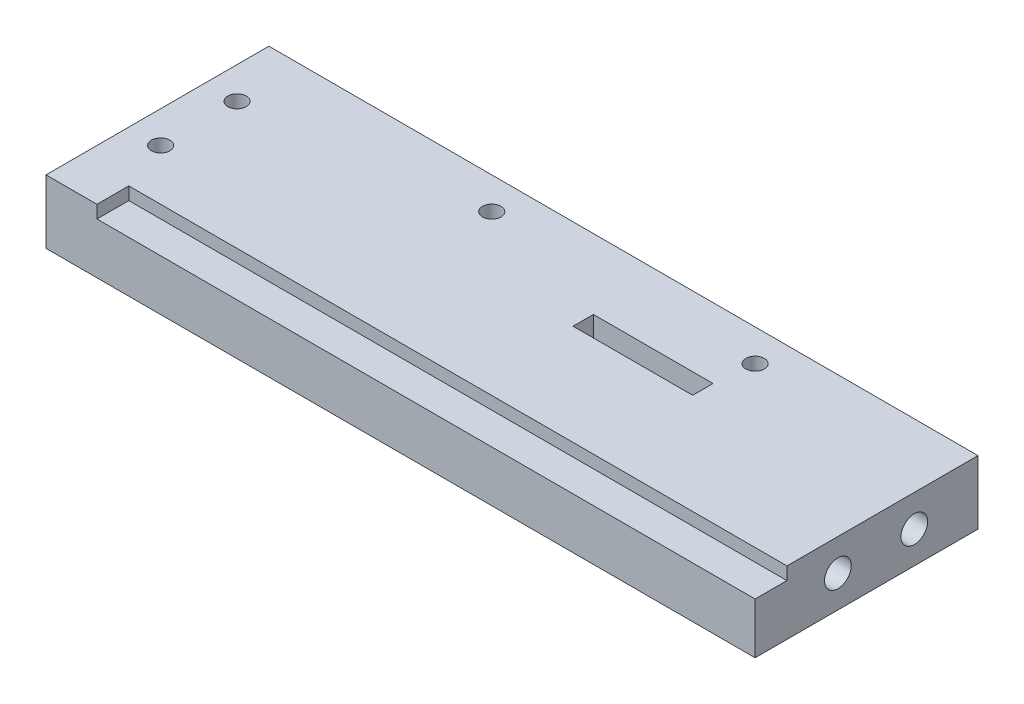
ISO-10303-21;
HEADER;
FILE_DESCRIPTION(('STEP AP214'),'2;1');
FILE_NAME('part.step','',(''),(''),'','','');
FILE_SCHEMA(('AUTOMOTIVE_DESIGN { 1 0 10303 214 1 1 1 1 }'));
ENDSEC;
DATA;
#1=APPLICATION_CONTEXT('core data for automotive mechanical design processes');
#2=APPLICATION_PROTOCOL_DEFINITION('international standard','automotive_design',2000,#1);
#3=PRODUCT_CONTEXT('',#1,'mechanical');
#4=PRODUCT('Part','Part','',(#3));
#5=PRODUCT_RELATED_PRODUCT_CATEGORY('part','',(#4));
#6=PRODUCT_DEFINITION_FORMATION('','',#4);
#7=PRODUCT_DEFINITION_CONTEXT('part definition',#1,'design');
#8=PRODUCT_DEFINITION('design','',#6,#7);
#9=PRODUCT_DEFINITION_SHAPE('','',#8);
#10=(LENGTH_UNIT() NAMED_UNIT(*) SI_UNIT(.MILLI.,.METRE.));
#11=(NAMED_UNIT(*) PLANE_ANGLE_UNIT() SI_UNIT($,.RADIAN.));
#12=(NAMED_UNIT(*) SI_UNIT($,.STERADIAN.) SOLID_ANGLE_UNIT());
#13=UNCERTAINTY_MEASURE_WITH_UNIT(LENGTH_MEASURE(1.E-05),#10,'distance_accuracy_value','');
#14=(GEOMETRIC_REPRESENTATION_CONTEXT(3) GLOBAL_UNCERTAINTY_ASSIGNED_CONTEXT((#13)) GLOBAL_UNIT_ASSIGNED_CONTEXT((#10,
#11,#12)) REPRESENTATION_CONTEXT('',''));
#15=CARTESIAN_POINT('',(0.,0.,0.));
#16=DIRECTION('',(0.,0.,1.));
#17=DIRECTION('',(1.,0.,0.));
#18=AXIS2_PLACEMENT_3D('',#15,#16,#17);
#19=CARTESIAN_POINT('',(24.6707153868862,-63.0696050775741,-125.648132810884));
#20=DIRECTION('',(1.,0.,0.));
#21=DIRECTION('',(0.,0.,-1.));
#22=AXIS2_PLACEMENT_3D('',#19,#20,#21);
#23=PLANE('',#22);
#24=CARTESIAN_POINT('',(24.6707153868862,-58.0696050775741,8.15000000000006));
#25=DIRECTION('',(1.,0.,0.));
#26=DIRECTION('',(0.,0.,-1.));
#27=AXIS2_PLACEMENT_3D('',#24,#25,#26);
#28=CIRCLE('',#27,2.1);
#29=CARTESIAN_POINT('',(24.6707153868862,-58.0696050775741,6.05000000000006));
#30=VERTEX_POINT('',#29);
#31=EDGE_CURVE('E203',#30,#30,#28,.T.);
#32=ORIENTED_EDGE('',*,*,#31,.F.);
#33=EDGE_LOOP('',(#32));
#34=FACE_BOUND('',#33,.T.);
#35=CARTESIAN_POINT('',(24.6707153868862,-58.0696050775741,-3.84999999999994));
#36=DIRECTION('',(1.,0.,0.));
#37=DIRECTION('',(0.,0.,-1.));
#38=AXIS2_PLACEMENT_3D('',#35,#36,#37);
#39=CIRCLE('',#38,2.1);
#40=CARTESIAN_POINT('',(24.6707153868862,-58.0696050775741,-5.94999999999994));
#41=VERTEX_POINT('',#40);
#42=EDGE_CURVE('E213',#41,#41,#39,.T.);
#43=ORIENTED_EDGE('',*,*,#42,.F.);
#44=EDGE_LOOP('',(#43));
#45=FACE_BOUND('',#44,.T.);
#46=DIRECTION('',(0.,1.,0.));
#47=VECTOR('',#46,1.);
#48=CARTESIAN_POINT('',(24.6707153868862,-8.06960507757404,16.1500000000001));
#49=LINE('',#48,#47);
#50=CARTESIAN_POINT('',(24.6707153868862,-55.0696050775741,16.1500000000001));
#51=VERTEX_POINT('',#50);
#52=CARTESIAN_POINT('',(24.6707153868862,-53.0696050775741,16.1500000000001));
#53=VERTEX_POINT('',#52);
#54=EDGE_CURVE('E232',#51,#53,#49,.T.);
#55=ORIENTED_EDGE('',*,*,#54,.F.);
#56=DIRECTION('',(0.,0.,-1.));
#57=VECTOR('',#56,1.);
#58=CARTESIAN_POINT('',(24.6707153868862,-55.0696050775741,21.1500000000001));
#59=LINE('',#58,#57);
#60=CARTESIAN_POINT('',(24.6707153868862,-55.0696050775741,21.1500000000001));
#61=VERTEX_POINT('',#60);
#62=EDGE_CURVE('E131',#61,#51,#59,.T.);
#63=ORIENTED_EDGE('',*,*,#62,.F.);
#64=DIRECTION('',(0.,1.,0.));
#65=VECTOR('',#64,1.);
#66=CARTESIAN_POINT('',(24.6707153868862,-63.0696050775741,21.1500000000001));
#67=LINE('',#66,#65);
#68=CARTESIAN_POINT('',(24.6707153868862,-63.0696050775741,21.1500000000001));
#69=VERTEX_POINT('',#68);
#70=EDGE_CURVE('E125',#69,#61,#67,.T.);
#71=ORIENTED_EDGE('',*,*,#70,.F.);
#72=DIRECTION('',(0.,0.,1.));
#73=VECTOR('',#72,1.);
#74=CARTESIAN_POINT('',(24.6707153868862,-63.0696050775741,-125.648132810884));
#75=LINE('',#74,#73);
#76=CARTESIAN_POINT('',(24.6707153868862,-63.0696050775741,-13.8499999999999));
#77=VERTEX_POINT('',#76);
#78=EDGE_CURVE('E128',#77,#69,#75,.T.);
#79=ORIENTED_EDGE('',*,*,#78,.F.);
#80=DIRECTION('',(0.,-1.,0.));
#81=VECTOR('',#80,1.);
#82=CARTESIAN_POINT('',(24.6707153868862,-63.0696050775741,-13.8499999999999));
#83=LINE('',#82,#81);
#84=CARTESIAN_POINT('',(24.6707153868862,-53.0696050775741,-13.8499999999999));
#85=VERTEX_POINT('',#84);
#86=EDGE_CURVE('E216',#85,#77,#83,.T.);
#87=ORIENTED_EDGE('',*,*,#86,.F.);
#88=DIRECTION('',(0.,0.,-1.));
#89=VECTOR('',#88,1.);
#90=CARTESIAN_POINT('',(24.6707153868862,-53.0696050775741,16.1500000000001));
#91=LINE('',#90,#89);
#92=EDGE_CURVE('E187',#53,#85,#91,.T.);
#93=ORIENTED_EDGE('',*,*,#92,.F.);
#94=EDGE_LOOP('',(#55,#63,#71,#79,#87,#93));
#95=FACE_BOUND('',#94,.T.);
#96=ADVANCED_FACE('F34',(#34,#45,#95),#23,.T.);
#97=CARTESIAN_POINT('',(-30.3292846131138,-58.669605077574,0.));
#98=DIRECTION('',(0.,1.,0.));
#99=DIRECTION('',(0.,0.,1.));
#100=AXIS2_PLACEMENT_3D('',#97,#98,#99);
#101=PLANE('',#100);
#102=DIRECTION('',(0.,0.,-1.));
#103=VECTOR('',#102,1.);
#104=CARTESIAN_POINT('',(-24.7192846131138,-58.669605077574,-2.84999999999994));
#105=LINE('',#104,#103);
#106=CARTESIAN_POINT('',(-24.7192846131138,-58.669605077574,0.350000000000056));
#107=VERTEX_POINT('',#106);
#108=CARTESIAN_POINT('',(-24.7192846131138,-58.669605077574,-2.84999999999994));
#109=VERTEX_POINT('',#108);
#110=EDGE_CURVE('E152',#107,#109,#105,.T.);
#111=ORIENTED_EDGE('',*,*,#110,.F.);
#112=DIRECTION('',(-1.,0.,0.));
#113=VECTOR('',#112,1.);
#114=CARTESIAN_POINT('',(-24.7192846131138,-58.669605077574,0.350000000000056));
#115=LINE('',#114,#113);
#116=CARTESIAN_POINT('',(-5.93928461311376,-58.669605077574,0.350000000000056));
#117=VERTEX_POINT('',#116);
#118=EDGE_CURVE('E164',#117,#107,#115,.T.);
#119=ORIENTED_EDGE('',*,*,#118,.F.);
#120=DIRECTION('',(0.,0.,1.));
#121=VECTOR('',#120,1.);
#122=CARTESIAN_POINT('',(-5.93928461311376,-58.669605077574,-2.84999999999994));
#123=LINE('',#122,#121);
#124=CARTESIAN_POINT('',(-5.93928461311376,-58.669605077574,-2.84999999999994));
#125=VERTEX_POINT('',#124);
#126=EDGE_CURVE('E162',#125,#117,#123,.T.);
#127=ORIENTED_EDGE('',*,*,#126,.F.);
#128=DIRECTION('',(1.,0.,0.));
#129=VECTOR('',#128,1.);
#130=CARTESIAN_POINT('',(-24.7192846131138,-58.669605077574,-2.84999999999994));
#131=LINE('',#130,#129);
#132=EDGE_CURVE('E155',#109,#125,#131,.T.);
#133=ORIENTED_EDGE('',*,*,#132,.F.);
#134=EDGE_LOOP('',(#111,#119,#127,#133));
#135=FACE_BOUND('',#134,.T.);
#136=ADVANCED_FACE('F345',(#135),#101,.T.);
#137=CARTESIAN_POINT('',(-24.7192846131138,-58.669605077574,0.350000000000056));
#138=DIRECTION('',(0.,0.,-1.));
#139=DIRECTION('',(-1.,0.,0.));
#140=AXIS2_PLACEMENT_3D('',#137,#138,#139);
#141=PLANE('',#140);
#142=DIRECTION('',(0.,1.,0.));
#143=VECTOR('',#142,1.);
#144=CARTESIAN_POINT('',(-5.93928461311376,-58.669605077574,0.350000000000056));
#145=LINE('',#144,#143);
#146=CARTESIAN_POINT('',(-5.93928461311376,-53.069605077574,0.350000000000056));
#147=VERTEX_POINT('',#146);
#148=EDGE_CURVE('E169',#117,#147,#145,.T.);
#149=ORIENTED_EDGE('',*,*,#148,.F.);
#150=ORIENTED_EDGE('',*,*,#118,.T.);
#151=DIRECTION('',(0.,1.,0.));
#152=VECTOR('',#151,1.);
#153=CARTESIAN_POINT('',(-24.7192846131138,-58.669605077574,0.350000000000056));
#154=LINE('',#153,#152);
#155=CARTESIAN_POINT('',(-24.7192846131138,-53.069605077574,0.350000000000056));
#156=VERTEX_POINT('',#155);
#157=EDGE_CURVE('E166',#107,#156,#154,.T.);
#158=ORIENTED_EDGE('',*,*,#157,.T.);
#159=DIRECTION('',(-1.,0.,0.));
#160=VECTOR('',#159,1.);
#161=CARTESIAN_POINT('',(-75.3292846131138,-53.069605077574,0.350000000000056));
#162=LINE('',#161,#160);
#163=EDGE_CURVE('E178',#147,#156,#162,.T.);
#164=ORIENTED_EDGE('',*,*,#163,.F.);
#165=EDGE_LOOP('',(#149,#150,#158,#164));
#166=FACE_BOUND('',#165,.T.);
#167=ADVANCED_FACE('F323',(#166),#141,.T.);
#168=CARTESIAN_POINT('',(-80.2292846131138,-61.1696050775741,-3.84999999999994));
#169=DIRECTION('',(0.,1.,0.));
#170=DIRECTION('',(0.,0.,1.));
#171=AXIS2_PLACEMENT_3D('',#168,#169,#170);
#172=PLANE('',#171);
#173=CARTESIAN_POINT('',(-81.6792846131138,-61.1696050775741,-3.84999999999994));
#174=DIRECTION('',(0.,-1.,0.));
#175=DIRECTION('',(0.,0.,-1.));
#176=AXIS2_PLACEMENT_3D('',#173,#174,#175);
#177=CIRCLE('',#176,1.44999999999999);
#178=CARTESIAN_POINT('',(-81.6792846131138,-61.1696050775741,-5.29999999999993));
#179=VERTEX_POINT('',#178);
#180=EDGE_CURVE('E274',#179,#179,#177,.T.);
#181=ORIENTED_EDGE('',*,*,#180,.F.);
#182=EDGE_LOOP('',(#181));
#183=FACE_BOUND('',#182,.T.);
#184=CARTESIAN_POINT('',(-81.6792846131138,-61.1696050775741,-3.84999999999994));
#185=DIRECTION('',(0.,-1.,0.));
#186=DIRECTION('',(0.,0.,-1.));
#187=AXIS2_PLACEMENT_3D('',#184,#185,#186);
#188=CIRCLE('',#187,2.475);
#189=CARTESIAN_POINT('',(-81.6792846131138,-61.1696050775741,-6.32499999999994));
#190=VERTEX_POINT('',#189);
#191=EDGE_CURVE('E271',#190,#190,#188,.T.);
#192=ORIENTED_EDGE('',*,*,#191,.T.);
#193=EDGE_LOOP('',(#192));
#194=FACE_BOUND('',#193,.T.);
#195=ADVANCED_FACE('F317',(#183,#194),#172,.F.);
#196=CARTESIAN_POINT('',(-81.6792846131138,-63.0696050775741,-3.84999999999994));
#197=DIRECTION('',(0.,-1.,0.));
#198=DIRECTION('',(0.,0.,-1.));
#199=AXIS2_PLACEMENT_3D('',#196,#197,#198);
#200=CYLINDRICAL_SURFACE('',#199,1.44999999999999);
#201=CARTESIAN_POINT('',(-81.6792846131138,-53.0696050775741,-3.84999999999994));
#202=DIRECTION('',(0.,1.,0.));
#203=DIRECTION('',(0.,0.,1.));
#204=AXIS2_PLACEMENT_3D('',#201,#202,#203);
#205=CIRCLE('',#204,1.44999999999999);
#206=CARTESIAN_POINT('',(-81.6792846131138,-53.0696050775741,-2.39999999999995));
#207=VERTEX_POINT('',#206);
#208=EDGE_CURVE('E11',#207,#207,#205,.F.);
#209=ORIENTED_EDGE('',*,*,#208,.F.);
#210=EDGE_LOOP('',(#209));
#211=FACE_BOUND('',#210,.T.);
#212=ORIENTED_EDGE('',*,*,#180,.T.);
#213=EDGE_LOOP('',(#212));
#214=FACE_BOUND('',#213,.T.);
#215=ADVANCED_FACE('F313',(#211,#214),#200,.F.);
#216=CARTESIAN_POINT('',(-81.6792846131138,-63.0696050775741,-3.84999999999994));
#217=DIRECTION('',(0.,-1.,0.));
#218=DIRECTION('',(0.,0.,-1.));
#219=AXIS2_PLACEMENT_3D('',#216,#217,#218);
#220=CYLINDRICAL_SURFACE('',#219,2.475);
#221=ORIENTED_EDGE('',*,*,#191,.F.);
#222=EDGE_LOOP('',(#221));
#223=FACE_BOUND('',#222,.T.);
#224=CARTESIAN_POINT('',(-81.6792846131138,-63.0696050775741,-3.84999999999994));
#225=DIRECTION('',(0.,-1.,0.));
#226=DIRECTION('',(0.,0.,-1.));
#227=AXIS2_PLACEMENT_3D('',#224,#225,#226);
#228=CIRCLE('',#227,2.475);
#229=CARTESIAN_POINT('',(-81.6792846131138,-63.0696050775741,-6.32499999999994));
#230=VERTEX_POINT('',#229);
#231=EDGE_CURVE('E268',#230,#230,#228,.T.);
#232=ORIENTED_EDGE('',*,*,#231,.T.);
#233=EDGE_LOOP('',(#232));
#234=FACE_BOUND('',#233,.T.);
#235=ADVANCED_FACE('F316',(#223,#234),#220,.F.);
#236=CARTESIAN_POINT('',(-80.2292846131138,-61.1696050775741,8.15000000000006));
#237=DIRECTION('',(0.,1.,0.));
#238=DIRECTION('',(0.,0.,1.));
#239=AXIS2_PLACEMENT_3D('',#236,#237,#238);
#240=PLANE('',#239);
#241=CARTESIAN_POINT('',(-81.6792846131138,-61.1696050775741,8.15000000000006));
#242=DIRECTION('',(0.,-1.,0.));
#243=DIRECTION('',(0.,0.,-1.));
#244=AXIS2_PLACEMENT_3D('',#241,#242,#243);
#245=CIRCLE('',#244,1.44999999999999);
#246=CARTESIAN_POINT('',(-81.6792846131138,-61.1696050775741,6.70000000000007));
#247=VERTEX_POINT('',#246);
#248=EDGE_CURVE('E265',#247,#247,#245,.T.);
#249=ORIENTED_EDGE('',*,*,#248,.F.);
#250=EDGE_LOOP('',(#249));
#251=FACE_BOUND('',#250,.T.);
#252=CARTESIAN_POINT('',(-81.6792846131138,-61.1696050775741,8.15000000000006));
#253=DIRECTION('',(0.,-1.,0.));
#254=DIRECTION('',(0.,0.,-1.));
#255=AXIS2_PLACEMENT_3D('',#252,#253,#254);
#256=CIRCLE('',#255,2.475);
#257=CARTESIAN_POINT('',(-81.6792846131138,-61.1696050775741,5.67500000000006));
#258=VERTEX_POINT('',#257);
#259=EDGE_CURVE('E262',#258,#258,#256,.T.);
#260=ORIENTED_EDGE('',*,*,#259,.T.);
#261=EDGE_LOOP('',(#260));
#262=FACE_BOUND('',#261,.T.);
#263=ADVANCED_FACE('F329',(#251,#262),#240,.F.);
#264=CARTESIAN_POINT('',(-81.6792846131138,-63.0696050775741,8.15000000000006));
#265=DIRECTION('',(0.,-1.,0.));
#266=DIRECTION('',(0.,0.,-1.));
#267=AXIS2_PLACEMENT_3D('',#264,#265,#266);
#268=CYLINDRICAL_SURFACE('',#267,1.44999999999999);
#269=CARTESIAN_POINT('',(-81.6792846131138,-53.0696050775741,8.15000000000006));
#270=DIRECTION('',(0.,1.,0.));
#271=DIRECTION('',(0.,0.,1.));
#272=AXIS2_PLACEMENT_3D('',#269,#270,#271);
#273=CIRCLE('',#272,1.44999999999999);
#274=CARTESIAN_POINT('',(-81.6792846131138,-53.0696050775741,9.60000000000005));
#275=VERTEX_POINT('',#274);
#276=EDGE_CURVE('E43',#275,#275,#273,.F.);
#277=ORIENTED_EDGE('',*,*,#276,.F.);
#278=EDGE_LOOP('',(#277));
#279=FACE_BOUND('',#278,.T.);
#280=ORIENTED_EDGE('',*,*,#248,.T.);
#281=EDGE_LOOP('',(#280));
#282=FACE_BOUND('',#281,.T.);
#283=ADVANCED_FACE('F402',(#279,#282),#268,.F.);
#284=CARTESIAN_POINT('',(-81.6792846131138,-63.0696050775741,8.15000000000006));
#285=DIRECTION('',(0.,-1.,0.));
#286=DIRECTION('',(0.,0.,-1.));
#287=AXIS2_PLACEMENT_3D('',#284,#285,#286);
#288=CYLINDRICAL_SURFACE('',#287,2.475);
#289=ORIENTED_EDGE('',*,*,#259,.F.);
#290=EDGE_LOOP('',(#289));
#291=FACE_BOUND('',#290,.T.);
#292=CARTESIAN_POINT('',(-81.6792846131138,-63.0696050775741,8.15000000000006));
#293=DIRECTION('',(0.,-1.,0.));
#294=DIRECTION('',(0.,0.,-1.));
#295=AXIS2_PLACEMENT_3D('',#292,#293,#294);
#296=CIRCLE('',#295,2.475);
#297=CARTESIAN_POINT('',(-81.6792846131138,-63.0696050775741,5.67500000000006));
#298=VERTEX_POINT('',#297);
#299=EDGE_CURVE('E259',#298,#298,#296,.T.);
#300=ORIENTED_EDGE('',*,*,#299,.T.);
#301=EDGE_LOOP('',(#300));
#302=FACE_BOUND('',#301,.T.);
#303=ADVANCED_FACE('F378',(#291,#302),#288,.F.);
#304=CARTESIAN_POINT('',(-45.2292846131138,-61.1696050775741,-8.84999999999994));
#305=DIRECTION('',(0.,1.,0.));
#306=DIRECTION('',(0.,0.,1.));
#307=AXIS2_PLACEMENT_3D('',#304,#305,#306);
#308=PLANE('',#307);
#309=CARTESIAN_POINT('',(-46.6792846131138,-61.1696050775741,-8.84999999999994));
#310=DIRECTION('',(0.,-1.,0.));
#311=DIRECTION('',(0.,0.,-1.));
#312=AXIS2_PLACEMENT_3D('',#309,#310,#311);
#313=CIRCLE('',#312,1.44999999999999);
#314=CARTESIAN_POINT('',(-46.6792846131138,-61.1696050775741,-10.2999999999999));
#315=VERTEX_POINT('',#314);
#316=EDGE_CURVE('E250',#315,#315,#313,.T.);
#317=ORIENTED_EDGE('',*,*,#316,.F.);
#318=EDGE_LOOP('',(#317));
#319=FACE_BOUND('',#318,.T.);
#320=CARTESIAN_POINT('',(-46.6792846131138,-61.1696050775741,-8.84999999999994));
#321=DIRECTION('',(0.,-1.,0.));
#322=DIRECTION('',(0.,0.,-1.));
#323=AXIS2_PLACEMENT_3D('',#320,#321,#322);
#324=CIRCLE('',#323,2.47499999999999);
#325=CARTESIAN_POINT('',(-46.6792846131138,-61.1696050775741,-11.3249999999999));
#326=VERTEX_POINT('',#325);
#327=EDGE_CURVE('E247',#326,#326,#324,.T.);
#328=ORIENTED_EDGE('',*,*,#327,.T.);
#329=EDGE_LOOP('',(#328));
#330=FACE_BOUND('',#329,.T.);
#331=ADVANCED_FACE('F375',(#319,#330),#308,.F.);
#332=CARTESIAN_POINT('',(-46.6792846131138,-63.0696050775741,-8.84999999999994));
#333=DIRECTION('',(0.,-1.,0.));
#334=DIRECTION('',(0.,0.,-1.));
#335=AXIS2_PLACEMENT_3D('',#332,#333,#334);
#336=CYLINDRICAL_SURFACE('',#335,1.44999999999999);
#337=CARTESIAN_POINT('',(-46.6792846131138,-53.0696050775741,-8.84999999999994));
#338=DIRECTION('',(0.,1.,0.));
#339=DIRECTION('',(0.,0.,1.));
#340=AXIS2_PLACEMENT_3D('',#337,#338,#339);
#341=CIRCLE('',#340,1.44999999999999);
#342=CARTESIAN_POINT('',(-46.6792846131138,-53.0696050775741,-7.39999999999995));
#343=VERTEX_POINT('',#342);
#344=EDGE_CURVE('E195',#343,#343,#341,.F.);
#345=ORIENTED_EDGE('',*,*,#344,.F.);
#346=EDGE_LOOP('',(#345));
#347=FACE_BOUND('',#346,.T.);
#348=ORIENTED_EDGE('',*,*,#316,.T.);
#349=EDGE_LOOP('',(#348));
#350=FACE_BOUND('',#349,.T.);
#351=ADVANCED_FACE('F373',(#347,#350),#336,.F.);
#352=CARTESIAN_POINT('',(-46.6792846131138,-63.0696050775741,-8.84999999999994));
#353=DIRECTION('',(0.,-1.,0.));
#354=DIRECTION('',(0.,0.,-1.));
#355=AXIS2_PLACEMENT_3D('',#352,#353,#354);
#356=CYLINDRICAL_SURFACE('',#355,2.47499999999999);
#357=ORIENTED_EDGE('',*,*,#327,.F.);
#358=EDGE_LOOP('',(#357));
#359=FACE_BOUND('',#358,.T.);
#360=CARTESIAN_POINT('',(-46.6792846131138,-63.0696050775741,-8.84999999999994));
#361=DIRECTION('',(0.,-1.,0.));
#362=DIRECTION('',(0.,0.,-1.));
#363=AXIS2_PLACEMENT_3D('',#360,#361,#362);
#364=CIRCLE('',#363,2.47499999999999);
#365=CARTESIAN_POINT('',(-46.6792846131138,-63.0696050775741,-11.3249999999999));
#366=VERTEX_POINT('',#365);
#367=EDGE_CURVE('E244',#366,#366,#364,.T.);
#368=ORIENTED_EDGE('',*,*,#367,.T.);
#369=EDGE_LOOP('',(#368));
#370=FACE_BOUND('',#369,.T.);
#371=ADVANCED_FACE('F366',(#359,#370),#356,.F.);
#372=CARTESIAN_POINT('',(-3.87928461311376,-61.1696050775741,-8.84999999999994));
#373=DIRECTION('',(0.,1.,0.));
#374=DIRECTION('',(0.,0.,1.));
#375=AXIS2_PLACEMENT_3D('',#372,#373,#374);
#376=PLANE('',#375);
#377=CARTESIAN_POINT('',(-5.32928461311376,-61.1696050775741,-8.84999999999994));
#378=DIRECTION('',(0.,-1.,0.));
#379=DIRECTION('',(0.,0.,-1.));
#380=AXIS2_PLACEMENT_3D('',#377,#378,#379);
#381=CIRCLE('',#380,1.44999999999999);
#382=CARTESIAN_POINT('',(-5.32928461311376,-61.1696050775741,-10.2999999999999));
#383=VERTEX_POINT('',#382);
#384=EDGE_CURVE('E241',#383,#383,#381,.T.);
#385=ORIENTED_EDGE('',*,*,#384,.F.);
#386=EDGE_LOOP('',(#385));
#387=FACE_BOUND('',#386,.T.);
#388=CARTESIAN_POINT('',(-5.32928461311376,-61.1696050775741,-8.84999999999994));
#389=DIRECTION('',(0.,-1.,0.));
#390=DIRECTION('',(0.,0.,-1.));
#391=AXIS2_PLACEMENT_3D('',#388,#389,#390);
#392=CIRCLE('',#391,2.47499999999999);
#393=CARTESIAN_POINT('',(-5.32928461311376,-61.1696050775741,-11.3249999999999));
#394=VERTEX_POINT('',#393);
#395=EDGE_CURVE('E238',#394,#394,#392,.T.);
#396=ORIENTED_EDGE('',*,*,#395,.T.);
#397=EDGE_LOOP('',(#396));
#398=FACE_BOUND('',#397,.T.);
#399=ADVANCED_FACE('F363',(#387,#398),#376,.F.);
#400=CARTESIAN_POINT('',(-5.32928461311376,-63.0696050775741,-8.84999999999994));
#401=DIRECTION('',(0.,-1.,0.));
#402=DIRECTION('',(0.,0.,-1.));
#403=AXIS2_PLACEMENT_3D('',#400,#401,#402);
#404=CYLINDRICAL_SURFACE('',#403,1.44999999999999);
#405=CARTESIAN_POINT('',(-5.32928461311376,-53.0696050775741,-8.84999999999994));
#406=DIRECTION('',(0.,1.,0.));
#407=DIRECTION('',(0.,0.,1.));
#408=AXIS2_PLACEMENT_3D('',#405,#406,#407);
#409=CIRCLE('',#408,1.44999999999999);
#410=CARTESIAN_POINT('',(-5.32928461311376,-53.0696050775741,-7.39999999999995));
#411=VERTEX_POINT('',#410);
#412=EDGE_CURVE('E193',#411,#411,#409,.F.);
#413=ORIENTED_EDGE('',*,*,#412,.F.);
#414=EDGE_LOOP('',(#413));
#415=FACE_BOUND('',#414,.T.);
#416=ORIENTED_EDGE('',*,*,#384,.T.);
#417=EDGE_LOOP('',(#416));
#418=FACE_BOUND('',#417,.T.);
#419=ADVANCED_FACE('F361',(#415,#418),#404,.F.);
#420=CARTESIAN_POINT('',(-5.32928461311376,-63.0696050775741,-8.84999999999994));
#421=DIRECTION('',(0.,-1.,0.));
#422=DIRECTION('',(0.,0.,-1.));
#423=AXIS2_PLACEMENT_3D('',#420,#421,#422);
#424=CYLINDRICAL_SURFACE('',#423,2.47499999999999);
#425=ORIENTED_EDGE('',*,*,#395,.F.);
#426=EDGE_LOOP('',(#425));
#427=FACE_BOUND('',#426,.T.);
#428=CARTESIAN_POINT('',(-5.32928461311376,-63.0696050775741,-8.84999999999994));
#429=DIRECTION('',(0.,-1.,0.));
#430=DIRECTION('',(0.,0.,-1.));
#431=AXIS2_PLACEMENT_3D('',#428,#429,#430);
#432=CIRCLE('',#431,2.47499999999999);
#433=CARTESIAN_POINT('',(-5.32928461311376,-63.0696050775741,-11.3249999999999));
#434=VERTEX_POINT('',#433);
#435=EDGE_CURVE('E235',#434,#434,#432,.T.);
#436=ORIENTED_EDGE('',*,*,#435,.T.);
#437=EDGE_LOOP('',(#436));
#438=FACE_BOUND('',#437,.T.);
#439=ADVANCED_FACE('F340',(#427,#438),#424,.F.);
#440=CARTESIAN_POINT('',(-86.6792846131138,46.930394922426,-13.8499999999999));
#441=DIRECTION('',(-1.,0.,0.));
#442=DIRECTION('',(0.,-1.,0.));
#443=AXIS2_PLACEMENT_3D('',#440,#441,#442);
#444=PLANE('',#443);
#445=DIRECTION('',(0.,-1.,0.));
#446=VECTOR('',#445,1.);
#447=CARTESIAN_POINT('',(-86.6792846131138,46.930394922426,21.1500000000001));
#448=LINE('',#447,#446);
#449=CARTESIAN_POINT('',(-86.6792846131138,-53.0696050775741,21.1500000000001));
#450=VERTEX_POINT('',#449);
#451=CARTESIAN_POINT('',(-86.6792846131138,-63.0696050775741,21.1500000000001));
#452=VERTEX_POINT('',#451);
#453=EDGE_CURVE('E151',#450,#452,#448,.T.);
#454=ORIENTED_EDGE('',*,*,#453,.F.);
#455=DIRECTION('',(0.,0.,1.));
#456=VECTOR('',#455,1.);
#457=CARTESIAN_POINT('',(-86.6792846131138,-53.0696050775741,-125.648132810884));
#458=LINE('',#457,#456);
#459=CARTESIAN_POINT('',(-86.6792846131138,-53.069605077574,-13.8499999999999));
#460=VERTEX_POINT('',#459);
#461=EDGE_CURVE('E145',#460,#450,#458,.T.);
#462=ORIENTED_EDGE('',*,*,#461,.F.);
#463=DIRECTION('',(0.,-1.,0.));
#464=VECTOR('',#463,1.);
#465=CARTESIAN_POINT('',(-86.6792846131138,46.930394922426,-13.8499999999999));
#466=LINE('',#465,#464);
#467=CARTESIAN_POINT('',(-86.6792846131138,-63.0696050775741,-13.8499999999999));
#468=VERTEX_POINT('',#467);
#469=EDGE_CURVE('E58',#460,#468,#466,.T.);
#470=ORIENTED_EDGE('',*,*,#469,.T.);
#471=DIRECTION('',(0.,0.,1.));
#472=VECTOR('',#471,1.);
#473=CARTESIAN_POINT('',(-86.6792846131138,-63.0696050775741,-13.8499999999999));
#474=LINE('',#473,#472);
#475=EDGE_CURVE('E191',#468,#452,#474,.T.);
#476=ORIENTED_EDGE('',*,*,#475,.T.);
#477=EDGE_LOOP('',(#454,#462,#470,#476));
#478=FACE_BOUND('',#477,.T.);
#479=ADVANCED_FACE('F36',(#478),#444,.T.);
#480=CARTESIAN_POINT('',(-86.6792846131138,-63.0696050775741,-13.8499999999999));
#481=DIRECTION('',(0.,-1.,0.));
#482=DIRECTION('',(0.,0.,-1.));
#483=AXIS2_PLACEMENT_3D('',#480,#481,#482);
#484=PLANE('',#483);
#485=ORIENTED_EDGE('',*,*,#435,.F.);
#486=EDGE_LOOP('',(#485));
#487=FACE_BOUND('',#486,.T.);
#488=ORIENTED_EDGE('',*,*,#367,.F.);
#489=EDGE_LOOP('',(#488));
#490=FACE_BOUND('',#489,.T.);
#491=ORIENTED_EDGE('',*,*,#299,.F.);
#492=EDGE_LOOP('',(#491));
#493=FACE_BOUND('',#492,.T.);
#494=ORIENTED_EDGE('',*,*,#231,.F.);
#495=EDGE_LOOP('',(#494));
#496=FACE_BOUND('',#495,.T.);
#497=DIRECTION('',(1.,0.,0.));
#498=VECTOR('',#497,1.);
#499=CARTESIAN_POINT('',(-86.6792846131138,-63.0696050775741,-13.8499999999999));
#500=LINE('',#499,#498);
#501=EDGE_CURVE('E144',#468,#77,#500,.T.);
#502=ORIENTED_EDGE('',*,*,#501,.T.);
#503=ORIENTED_EDGE('',*,*,#78,.T.);
#504=DIRECTION('',(1.,0.,0.));
#505=VECTOR('',#504,1.);
#506=CARTESIAN_POINT('',(-86.6792846131138,-63.0696050775741,21.1500000000001));
#507=LINE('',#506,#505);
#508=EDGE_CURVE('E142',#452,#69,#507,.T.);
#509=ORIENTED_EDGE('',*,*,#508,.F.);
#510=ORIENTED_EDGE('',*,*,#475,.F.);
#511=EDGE_LOOP('',(#502,#503,#509,#510));
#512=FACE_BOUND('',#511,.T.);
#513=ADVANCED_FACE('F141',(#487,#490,#493,#496,#512),#484,.T.);
#514=CARTESIAN_POINT('',(-30.3292846131138,-8.06960507757404,-13.8499999999999));
#515=DIRECTION('',(0.,0.,1.));
#516=DIRECTION('',(1.,0.,0.));
#517=AXIS2_PLACEMENT_3D('',#514,#515,#516);
#518=PLANE('',#517);
#519=DIRECTION('',(1.,0.,0.));
#520=VECTOR('',#519,1.);
#521=CARTESIAN_POINT('',(-86.6792846131138,-53.0696050775741,-13.8499999999999));
#522=LINE('',#521,#520);
#523=EDGE_CURVE('E51',#460,#85,#522,.T.);
#524=ORIENTED_EDGE('',*,*,#523,.T.);
#525=ORIENTED_EDGE('',*,*,#86,.T.);
#526=ORIENTED_EDGE('',*,*,#501,.F.);
#527=ORIENTED_EDGE('',*,*,#469,.F.);
#528=EDGE_LOOP('',(#524,#525,#526,#527));
#529=FACE_BOUND('',#528,.T.);
#530=ADVANCED_FACE('F295',(#529),#518,.F.);
#531=CARTESIAN_POINT('',(-78.6792846131138,-55.0696050775741,21.1500000000001));
#532=DIRECTION('',(0.,1.,0.));
#533=DIRECTION('',(0.,0.,1.));
#534=AXIS2_PLACEMENT_3D('',#531,#532,#533);
#535=PLANE('',#534);
#536=DIRECTION('',(1.,0.,0.));
#537=VECTOR('',#536,1.);
#538=CARTESIAN_POINT('',(-78.6792846131138,-55.0696050775741,21.1500000000001));
#539=LINE('',#538,#537);
#540=CARTESIAN_POINT('',(-78.6792846131138,-55.0696050775741,21.1500000000001));
#541=VERTEX_POINT('',#540);
#542=EDGE_CURVE('E280',#541,#61,#539,.T.);
#543=ORIENTED_EDGE('',*,*,#542,.T.);
#544=ORIENTED_EDGE('',*,*,#62,.T.);
#545=DIRECTION('',(1.,0.,0.));
#546=VECTOR('',#545,1.);
#547=CARTESIAN_POINT('',(-78.6792846131138,-55.0696050775741,16.1500000000001));
#548=LINE('',#547,#546);
#549=CARTESIAN_POINT('',(-78.6792846131138,-55.0696050775741,16.1500000000001));
#550=VERTEX_POINT('',#549);
#551=EDGE_CURVE('E281',#550,#51,#548,.T.);
#552=ORIENTED_EDGE('',*,*,#551,.F.);
#553=DIRECTION('',(0.,0.,-1.));
#554=VECTOR('',#553,1.);
#555=CARTESIAN_POINT('',(-78.6792846131138,-55.0696050775741,21.1500000000001));
#556=LINE('',#555,#554);
#557=EDGE_CURVE('E157',#541,#550,#556,.T.);
#558=ORIENTED_EDGE('',*,*,#557,.F.);
#559=EDGE_LOOP('',(#543,#544,#552,#558));
#560=FACE_BOUND('',#559,.T.);
#561=ADVANCED_FACE('F292',(#560),#535,.T.);
#562=CARTESIAN_POINT('',(-78.6792846131138,38.930394922426,21.1500000000001));
#563=DIRECTION('',(1.,0.,0.));
#564=DIRECTION('',(0.,1.,0.));
#565=AXIS2_PLACEMENT_3D('',#562,#563,#564);
#566=PLANE('',#565);
#567=DIRECTION('',(0.,-1.,0.));
#568=VECTOR('',#567,1.);
#569=CARTESIAN_POINT('',(-78.6792846131138,38.930394922426,16.1500000000001));
#570=LINE('',#569,#568);
#571=CARTESIAN_POINT('',(-78.6792846131138,-53.0696050775741,16.1500000000001));
#572=VERTEX_POINT('',#571);
#573=EDGE_CURVE('E277',#572,#550,#570,.T.);
#574=ORIENTED_EDGE('',*,*,#573,.F.);
#575=DIRECTION('',(0.,0.,1.));
#576=VECTOR('',#575,1.);
#577=CARTESIAN_POINT('',(-78.6792846131138,-53.0696050775741,21.1500000000001));
#578=LINE('',#577,#576);
#579=CARTESIAN_POINT('',(-78.6792846131138,-53.0696050775741,21.1500000000001));
#580=VERTEX_POINT('',#579);
#581=EDGE_CURVE('E218',#572,#580,#578,.T.);
#582=ORIENTED_EDGE('',*,*,#581,.T.);
#583=DIRECTION('',(0.,-1.,0.));
#584=VECTOR('',#583,1.);
#585=CARTESIAN_POINT('',(-78.6792846131138,38.930394922426,21.1500000000001));
#586=LINE('',#585,#584);
#587=EDGE_CURVE('E278',#580,#541,#586,.T.);
#588=ORIENTED_EDGE('',*,*,#587,.T.);
#589=ORIENTED_EDGE('',*,*,#557,.T.);
#590=EDGE_LOOP('',(#574,#582,#588,#589));
#591=FACE_BOUND('',#590,.T.);
#592=ADVANCED_FACE('F289',(#591),#566,.T.);
#593=CARTESIAN_POINT('',(-30.3292846131138,-8.06960507757404,21.1500000000001));
#594=DIRECTION('',(0.,0.,1.));
#595=DIRECTION('',(1.,0.,0.));
#596=AXIS2_PLACEMENT_3D('',#593,#594,#595);
#597=PLANE('',#596);
#598=ORIENTED_EDGE('',*,*,#587,.F.);
#599=DIRECTION('',(-1.,0.,0.));
#600=VECTOR('',#599,1.);
#601=CARTESIAN_POINT('',(-86.6792846131138,-53.0696050775741,21.1500000000001));
#602=LINE('',#601,#600);
#603=EDGE_CURVE('E136',#580,#450,#602,.T.);
#604=ORIENTED_EDGE('',*,*,#603,.T.);
#605=ORIENTED_EDGE('',*,*,#453,.T.);
#606=ORIENTED_EDGE('',*,*,#508,.T.);
#607=ORIENTED_EDGE('',*,*,#70,.T.);
#608=ORIENTED_EDGE('',*,*,#542,.F.);
#609=EDGE_LOOP('',(#598,#604,#605,#606,#607,#608));
#610=FACE_BOUND('',#609,.T.);
#611=ADVANCED_FACE('F148',(#610),#597,.T.);
#612=CARTESIAN_POINT('',(-24.7192846131138,-58.669605077574,-2.84999999999994));
#613=DIRECTION('',(1.,0.,0.));
#614=DIRECTION('',(0.,0.,-1.));
#615=AXIS2_PLACEMENT_3D('',#612,#613,#614);
#616=PLANE('',#615);
#617=DIRECTION('',(0.,1.,0.));
#618=VECTOR('',#617,1.);
#619=CARTESIAN_POINT('',(-24.7192846131138,-58.669605077574,-2.84999999999994));
#620=LINE('',#619,#618);
#621=CARTESIAN_POINT('',(-24.7192846131138,-53.0696050775741,-2.84999999999994));
#622=VERTEX_POINT('',#621);
#623=EDGE_CURVE('E175',#109,#622,#620,.T.);
#624=ORIENTED_EDGE('',*,*,#623,.T.);
#625=DIRECTION('',(0.,0.,1.));
#626=VECTOR('',#625,1.);
#627=CARTESIAN_POINT('',(-24.7192846131138,-53.069605077574,16.1500000000001));
#628=LINE('',#627,#626);
#629=EDGE_CURVE('E183',#622,#156,#628,.T.);
#630=ORIENTED_EDGE('',*,*,#629,.T.);
#631=ORIENTED_EDGE('',*,*,#157,.F.);
#632=ORIENTED_EDGE('',*,*,#110,.T.);
#633=EDGE_LOOP('',(#624,#630,#631,#632));
#634=FACE_BOUND('',#633,.T.);
#635=ADVANCED_FACE('F415',(#634),#616,.T.);
#636=CARTESIAN_POINT('',(-5.93928461311376,-58.669605077574,-2.84999999999994));
#637=DIRECTION('',(-1.,0.,0.));
#638=DIRECTION('',(0.,0.,1.));
#639=AXIS2_PLACEMENT_3D('',#636,#637,#638);
#640=PLANE('',#639);
#641=DIRECTION('',(0.,0.,-1.));
#642=VECTOR('',#641,1.);
#643=CARTESIAN_POINT('',(-5.93928461311375,-53.069605077574,16.1500000000001));
#644=LINE('',#643,#642);
#645=CARTESIAN_POINT('',(-5.93928461311376,-53.0696050775741,-2.84999999999994));
#646=VERTEX_POINT('',#645);
#647=EDGE_CURVE('E181',#147,#646,#644,.T.);
#648=ORIENTED_EDGE('',*,*,#647,.T.);
#649=DIRECTION('',(0.,1.,0.));
#650=VECTOR('',#649,1.);
#651=CARTESIAN_POINT('',(-5.93928461311376,-58.669605077574,-2.84999999999994));
#652=LINE('',#651,#650);
#653=EDGE_CURVE('E172',#125,#646,#652,.T.);
#654=ORIENTED_EDGE('',*,*,#653,.F.);
#655=ORIENTED_EDGE('',*,*,#126,.T.);
#656=ORIENTED_EDGE('',*,*,#148,.T.);
#657=EDGE_LOOP('',(#648,#654,#655,#656));
#658=FACE_BOUND('',#657,.T.);
#659=ADVANCED_FACE('F420',(#658),#640,.T.);
#660=CARTESIAN_POINT('',(-24.7192846131138,-58.669605077574,-2.84999999999994));
#661=DIRECTION('',(0.,0.,1.));
#662=DIRECTION('',(1.,0.,0.));
#663=AXIS2_PLACEMENT_3D('',#660,#661,#662);
#664=PLANE('',#663);
#665=ORIENTED_EDGE('',*,*,#653,.T.);
#666=DIRECTION('',(-1.,0.,0.));
#667=VECTOR('',#666,1.);
#668=CARTESIAN_POINT('',(-24.7192846131138,-53.0696050775741,-2.84999999999994));
#669=LINE('',#668,#667);
#670=EDGE_CURVE('E228',#646,#622,#669,.T.);
#671=ORIENTED_EDGE('',*,*,#670,.T.);
#672=ORIENTED_EDGE('',*,*,#623,.F.);
#673=ORIENTED_EDGE('',*,*,#132,.T.);
#674=EDGE_LOOP('',(#665,#671,#672,#673));
#675=FACE_BOUND('',#674,.T.);
#676=ADVANCED_FACE('F302',(#675),#664,.T.);
#677=CARTESIAN_POINT('',(-76.6792846131138,-53.069605077574,16.1500000000001));
#678=DIRECTION('',(0.,-1.,0.));
#679=DIRECTION('',(1.,0.,0.));
#680=AXIS2_PLACEMENT_3D('',#677,#678,#679);
#681=PLANE('',#680);
#682=ORIENTED_EDGE('',*,*,#670,.F.);
#683=ORIENTED_EDGE('',*,*,#647,.F.);
#684=ORIENTED_EDGE('',*,*,#163,.T.);
#685=ORIENTED_EDGE('',*,*,#629,.F.);
#686=EDGE_LOOP('',(#682,#683,#684,#685));
#687=FACE_BOUND('',#686,.T.);
#688=ORIENTED_EDGE('',*,*,#92,.T.);
#689=ORIENTED_EDGE('',*,*,#523,.F.);
#690=ORIENTED_EDGE('',*,*,#461,.T.);
#691=ORIENTED_EDGE('',*,*,#603,.F.);
#692=ORIENTED_EDGE('',*,*,#581,.F.);
#693=DIRECTION('',(-1.,0.,0.));
#694=VECTOR('',#693,1.);
#695=CARTESIAN_POINT('',(-76.6792846131138,-53.069605077574,16.1500000000001));
#696=LINE('',#695,#694);
#697=EDGE_CURVE('E185',#53,#572,#696,.T.);
#698=ORIENTED_EDGE('',*,*,#697,.F.);
#699=EDGE_LOOP('',(#688,#689,#690,#691,#692,#698));
#700=FACE_BOUND('',#699,.T.);
#701=ORIENTED_EDGE('',*,*,#276,.T.);
#702=EDGE_LOOP('',(#701));
#703=FACE_BOUND('',#702,.T.);
#704=ORIENTED_EDGE('',*,*,#412,.T.);
#705=EDGE_LOOP('',(#704));
#706=FACE_BOUND('',#705,.T.);
#707=ORIENTED_EDGE('',*,*,#344,.T.);
#708=EDGE_LOOP('',(#707));
#709=FACE_BOUND('',#708,.T.);
#710=ORIENTED_EDGE('',*,*,#208,.T.);
#711=EDGE_LOOP('',(#710));
#712=FACE_BOUND('',#711,.T.);
#713=ADVANCED_FACE('F299',(#687,#700,#703,#706,#709,#712),#681,.F.);
#714=CARTESIAN_POINT('',(-30.3292846131138,-8.06960507757404,16.1500000000001));
#715=DIRECTION('',(0.,0.,1.));
#716=DIRECTION('',(1.,0.,0.));
#717=AXIS2_PLACEMENT_3D('',#714,#715,#716);
#718=PLANE('',#717);
#719=ORIENTED_EDGE('',*,*,#697,.T.);
#720=ORIENTED_EDGE('',*,*,#573,.T.);
#721=ORIENTED_EDGE('',*,*,#551,.T.);
#722=ORIENTED_EDGE('',*,*,#54,.T.);
#723=EDGE_LOOP('',(#719,#720,#721,#722));
#724=FACE_BOUND('',#723,.T.);
#725=ADVANCED_FACE('F298',(#724),#718,.T.);
#726=CARTESIAN_POINT('',(18.1707153868862,-58.0696050775741,-3.84999999999994));
#727=DIRECTION('',(1.,0.,0.));
#728=DIRECTION('',(0.,0.,-1.));
#729=AXIS2_PLACEMENT_3D('',#726,#727,#728);
#730=PLANE('',#729);
#731=CARTESIAN_POINT('',(18.1707153868862,-58.0696050775741,-3.84999999999994));
#732=DIRECTION('',(1.,0.,0.));
#733=DIRECTION('',(0.,0.,-1.));
#734=AXIS2_PLACEMENT_3D('',#731,#732,#733);
#735=CIRCLE('',#734,2.1);
#736=CARTESIAN_POINT('',(18.1707153868862,-58.0696050775741,-5.94999999999994));
#737=VERTEX_POINT('',#736);
#738=EDGE_CURVE('E208',#737,#737,#735,.T.);
#739=ORIENTED_EDGE('',*,*,#738,.T.);
#740=EDGE_LOOP('',(#739));
#741=FACE_BOUND('',#740,.T.);
#742=CARTESIAN_POINT('',(18.1707153868862,-58.0696050775741,-3.84999999999994));
#743=DIRECTION('',(1.,0.,0.));
#744=DIRECTION('',(0.,0.,-1.));
#745=AXIS2_PLACEMENT_3D('',#742,#743,#744);
#746=CIRCLE('',#745,1.44999999999999);
#747=CARTESIAN_POINT('',(18.1707153868862,-58.0696050775741,-5.29999999999993));
#748=VERTEX_POINT('',#747);
#749=EDGE_CURVE('E196',#748,#748,#746,.F.);
#750=ORIENTED_EDGE('',*,*,#749,.T.);
#751=EDGE_LOOP('',(#750));
#752=FACE_BOUND('',#751,.T.);
#753=ADVANCED_FACE('F430',(#741,#752),#730,.T.);
#754=CARTESIAN_POINT('',(18.1707153868862,-58.0696050775741,-3.84999999999994));
#755=DIRECTION('',(1.,0.,0.));
#756=DIRECTION('',(0.,0.,-1.));
#757=AXIS2_PLACEMENT_3D('',#754,#755,#756);
#758=CYLINDRICAL_SURFACE('',#757,2.1);
#759=CARTESIAN_POINT('',(18.1707153868862,-58.0696050775741,-5.94999999999994));
#760=CARTESIAN_POINT('',(18.2384237202196,-58.0696050775741,-5.94999999999994));
#761=CARTESIAN_POINT('',(18.3061320535529,-58.0696050775741,-5.94999999999994));
#762=CARTESIAN_POINT('',(18.4415487202196,-58.0696050775741,-5.94999999999994));
#763=CARTESIAN_POINT('',(18.5092570535529,-58.0696050775741,-5.94999999999994));
#764=CARTESIAN_POINT('',(18.6446737202196,-58.0696050775741,-5.94999999999994));
#765=CARTESIAN_POINT('',(18.7123820535529,-58.0696050775741,-5.94999999999994));
#766=CARTESIAN_POINT('',(18.8477987202196,-58.0696050775741,-5.94999999999994));
#767=CARTESIAN_POINT('',(18.9155070535529,-58.0696050775741,-5.94999999999994));
#768=CARTESIAN_POINT('',(19.0509237202196,-58.0696050775741,-5.94999999999994));
#769=CARTESIAN_POINT('',(19.1186320535529,-58.0696050775741,-5.94999999999994));
#770=CARTESIAN_POINT('',(19.2540487202196,-58.0696050775741,-5.94999999999994));
#771=CARTESIAN_POINT('',(19.3217570535529,-58.0696050775741,-5.94999999999994));
#772=CARTESIAN_POINT('',(19.4571737202196,-58.0696050775741,-5.94999999999994));
#773=CARTESIAN_POINT('',(19.5248820535529,-58.0696050775741,-5.94999999999994));
#774=CARTESIAN_POINT('',(19.6602987202196,-58.0696050775741,-5.94999999999994));
#775=CARTESIAN_POINT('',(19.7280070535529,-58.0696050775741,-5.94999999999994));
#776=CARTESIAN_POINT('',(19.8634237202196,-58.0696050775741,-5.94999999999994));
#777=CARTESIAN_POINT('',(19.9311320535529,-58.0696050775741,-5.94999999999994));
#778=CARTESIAN_POINT('',(20.0665487202196,-58.0696050775741,-5.94999999999994));
#779=CARTESIAN_POINT('',(20.1342570535529,-58.0696050775741,-5.94999999999994));
#780=CARTESIAN_POINT('',(20.2696737202196,-58.0696050775741,-5.94999999999994));
#781=CARTESIAN_POINT('',(20.3373820535529,-58.0696050775741,-5.94999999999994));
#782=CARTESIAN_POINT('',(20.4727987202196,-58.0696050775741,-5.94999999999994));
#783=CARTESIAN_POINT('',(20.5405070535529,-58.0696050775741,-5.94999999999994));
#784=CARTESIAN_POINT('',(20.6759237202196,-58.0696050775741,-5.94999999999994));
#785=CARTESIAN_POINT('',(20.7436320535529,-58.0696050775741,-5.94999999999994));
#786=CARTESIAN_POINT('',(20.8790487202196,-58.0696050775741,-5.94999999999994));
#787=CARTESIAN_POINT('',(20.9467570535529,-58.0696050775741,-5.94999999999994));
#788=CARTESIAN_POINT('',(21.0821737202196,-58.0696050775741,-5.94999999999994));
#789=CARTESIAN_POINT('',(21.1498820535529,-58.0696050775741,-5.94999999999994));
#790=CARTESIAN_POINT('',(21.2852987202196,-58.0696050775741,-5.94999999999994));
#791=CARTESIAN_POINT('',(21.3530070535529,-58.0696050775741,-5.94999999999994));
#792=CARTESIAN_POINT('',(21.4884237202196,-58.0696050775741,-5.94999999999994));
#793=CARTESIAN_POINT('',(21.5561320535529,-58.0696050775741,-5.94999999999994));
#794=CARTESIAN_POINT('',(21.6915487202196,-58.0696050775741,-5.94999999999994));
#795=CARTESIAN_POINT('',(21.7592570535529,-58.0696050775741,-5.94999999999994));
#796=CARTESIAN_POINT('',(21.8946737202196,-58.0696050775741,-5.94999999999994));
#797=CARTESIAN_POINT('',(21.9623820535529,-58.0696050775741,-5.94999999999994));
#798=CARTESIAN_POINT('',(22.0977987202196,-58.0696050775741,-5.94999999999994));
#799=CARTESIAN_POINT('',(22.1655070535529,-58.0696050775741,-5.94999999999994));
#800=CARTESIAN_POINT('',(22.3009237202196,-58.0696050775741,-5.94999999999994));
#801=CARTESIAN_POINT('',(22.3686320535529,-58.0696050775741,-5.94999999999994));
#802=CARTESIAN_POINT('',(22.5040487202196,-58.0696050775741,-5.94999999999994));
#803=CARTESIAN_POINT('',(22.5717570535529,-58.0696050775741,-5.94999999999994));
#804=CARTESIAN_POINT('',(22.7071737202196,-58.0696050775741,-5.94999999999994));
#805=CARTESIAN_POINT('',(22.7748820535529,-58.0696050775741,-5.94999999999994));
#806=CARTESIAN_POINT('',(22.9102987202196,-58.0696050775741,-5.94999999999994));
#807=CARTESIAN_POINT('',(22.9780070535529,-58.0696050775741,-5.94999999999994));
#808=CARTESIAN_POINT('',(23.1134237202196,-58.0696050775741,-5.94999999999994));
#809=CARTESIAN_POINT('',(23.1811320535529,-58.0696050775741,-5.94999999999994));
#810=CARTESIAN_POINT('',(23.3165487202196,-58.0696050775741,-5.94999999999994));
#811=CARTESIAN_POINT('',(23.3842570535529,-58.0696050775741,-5.94999999999994));
#812=CARTESIAN_POINT('',(23.5196737202196,-58.0696050775741,-5.94999999999994));
#813=CARTESIAN_POINT('',(23.5873820535529,-58.0696050775741,-5.94999999999994));
#814=CARTESIAN_POINT('',(23.7227987202196,-58.0696050775741,-5.94999999999994));
#815=CARTESIAN_POINT('',(23.7905070535529,-58.0696050775741,-5.94999999999994));
#816=CARTESIAN_POINT('',(23.9259237202196,-58.0696050775741,-5.94999999999994));
#817=CARTESIAN_POINT('',(23.9936320535529,-58.0696050775741,-5.94999999999994));
#818=CARTESIAN_POINT('',(24.1290487202196,-58.0696050775741,-5.94999999999994));
#819=CARTESIAN_POINT('',(24.1967570535529,-58.0696050775741,-5.94999999999994));
#820=CARTESIAN_POINT('',(24.3321737202196,-58.0696050775741,-5.94999999999994));
#821=CARTESIAN_POINT('',(24.3998820535529,-58.0696050775741,-5.94999999999994));
#822=CARTESIAN_POINT('',(24.5352987202196,-58.0696050775741,-5.94999999999994));
#823=CARTESIAN_POINT('',(24.6030070535529,-58.0696050775741,-5.94999999999994));
#824=CARTESIAN_POINT('',(24.6707153868862,-58.0696050775741,-5.94999999999994));
#825=B_SPLINE_CURVE_WITH_KNOTS('',3,(#759,#760,#761,#762,#763,#764,#765,#766,#767,#768,#769,
#770,#771,#772,#773,#774,#775,#776,#777,#778,#779,#780,#781,#782,#783,#784,#785,#786,#787,#788,
#789,#790,#791,#792,#793,#794,#795,#796,#797,#798,#799,#800,#801,#802,#803,#804,#805,#806,#807,
#808,#809,#810,#811,#812,#813,#814,#815,#816,#817,#818,#819,#820,#821,#822,#823,#824),
.UNSPECIFIED.,.F.,.F.,(4,2,2,2,2,2,2,2,2,2,2,2,2,2,2,2,2,2,2,2,2,2,2,2,2,2,2,2,2,2,2,2,4),(0.,
0.203124999999998,0.406249999999997,0.609374999999999,0.812499999999997,1.015625,1.21875,
1.421875,1.625,1.828125,2.03125,2.234375,2.4375,2.640625,2.84375,3.046875,3.25,3.453125,3.65625,
3.859375,4.0625,4.26562499999999,4.46875,4.671875,4.875,5.078125,5.28125,5.484375,5.6875,
5.890625,6.09374999999999,6.296875,6.5),.UNSPECIFIED.);
#826=EDGE_CURVE('BSEAM357',#737,#41,#825,.T.);
#827=ORIENTED_EDGE('',*,*,#738,.F.);
#828=ORIENTED_EDGE('',*,*,#42,.T.);
#829=ORIENTED_EDGE('',*,*,#826,.T.);
#830=ORIENTED_EDGE('',*,*,#826,.F.);
#831=EDGE_LOOP('',(#827,#829,#828,#830));
#832=FACE_BOUND('',#831,.T.);
#833=ADVANCED_FACE('F357',(#832),#758,.F.);
#834=CARTESIAN_POINT('',(18.1707153868862,-58.0696050775741,8.15000000000006));
#835=DIRECTION('',(1.,0.,0.));
#836=DIRECTION('',(0.,0.,-1.));
#837=AXIS2_PLACEMENT_3D('',#834,#835,#836);
#838=PLANE('',#837);
#839=CARTESIAN_POINT('',(18.1707153868862,-58.0696050775741,8.15000000000006));
#840=DIRECTION('',(1.,0.,0.));
#841=DIRECTION('',(0.,0.,-1.));
#842=AXIS2_PLACEMENT_3D('',#839,#840,#841);
#843=CIRCLE('',#842,2.1);
#844=CARTESIAN_POINT('',(18.1707153868862,-58.0696050775741,6.05000000000006));
#845=VERTEX_POINT('',#844);
#846=EDGE_CURVE('E198',#845,#845,#843,.T.);
#847=ORIENTED_EDGE('',*,*,#846,.T.);
#848=EDGE_LOOP('',(#847));
#849=FACE_BOUND('',#848,.T.);
#850=CARTESIAN_POINT('',(18.1707153868862,-58.069605077574,8.15000000000006));
#851=DIRECTION('',(1.,0.,0.));
#852=DIRECTION('',(0.,0.,-1.));
#853=AXIS2_PLACEMENT_3D('',#850,#851,#852);
#854=CIRCLE('',#853,1.44999999999999);
#855=CARTESIAN_POINT('',(18.1707153868862,-58.069605077574,6.70000000000007));
#856=VERTEX_POINT('',#855);
#857=EDGE_CURVE('E38',#856,#856,#854,.F.);
#858=ORIENTED_EDGE('',*,*,#857,.T.);
#859=EDGE_LOOP('',(#858));
#860=FACE_BOUND('',#859,.T.);
#861=ADVANCED_FACE('F438',(#849,#860),#838,.T.);
#862=CARTESIAN_POINT('',(18.1707153868862,-58.0696050775741,8.15000000000006));
#863=DIRECTION('',(1.,0.,0.));
#864=DIRECTION('',(0.,0.,-1.));
#865=AXIS2_PLACEMENT_3D('',#862,#863,#864);
#866=CYLINDRICAL_SURFACE('',#865,2.1);
#867=CARTESIAN_POINT('',(18.1707153868862,-58.0696050775741,6.05000000000006));
#868=CARTESIAN_POINT('',(18.2384237202196,-58.0696050775741,6.05000000000006));
#869=CARTESIAN_POINT('',(18.3061320535529,-58.0696050775741,6.05000000000006));
#870=CARTESIAN_POINT('',(18.4415487202196,-58.0696050775741,6.05000000000006));
#871=CARTESIAN_POINT('',(18.5092570535529,-58.0696050775741,6.05000000000006));
#872=CARTESIAN_POINT('',(18.6446737202196,-58.0696050775741,6.05000000000006));
#873=CARTESIAN_POINT('',(18.7123820535529,-58.0696050775741,6.05000000000006));
#874=CARTESIAN_POINT('',(18.8477987202196,-58.0696050775741,6.05000000000006));
#875=CARTESIAN_POINT('',(18.9155070535529,-58.0696050775741,6.05000000000006));
#876=CARTESIAN_POINT('',(19.0509237202196,-58.0696050775741,6.05000000000006));
#877=CARTESIAN_POINT('',(19.1186320535529,-58.0696050775741,6.05000000000006));
#878=CARTESIAN_POINT('',(19.2540487202196,-58.0696050775741,6.05000000000006));
#879=CARTESIAN_POINT('',(19.3217570535529,-58.0696050775741,6.05000000000006));
#880=CARTESIAN_POINT('',(19.4571737202196,-58.0696050775741,6.05000000000006));
#881=CARTESIAN_POINT('',(19.5248820535529,-58.0696050775741,6.05000000000006));
#882=CARTESIAN_POINT('',(19.6602987202196,-58.0696050775741,6.05000000000006));
#883=CARTESIAN_POINT('',(19.7280070535529,-58.0696050775741,6.05000000000006));
#884=CARTESIAN_POINT('',(19.8634237202196,-58.0696050775741,6.05000000000006));
#885=CARTESIAN_POINT('',(19.9311320535529,-58.0696050775741,6.05000000000006));
#886=CARTESIAN_POINT('',(20.0665487202196,-58.0696050775741,6.05000000000006));
#887=CARTESIAN_POINT('',(20.1342570535529,-58.0696050775741,6.05000000000006));
#888=CARTESIAN_POINT('',(20.2696737202196,-58.0696050775741,6.05000000000006));
#889=CARTESIAN_POINT('',(20.3373820535529,-58.0696050775741,6.05000000000006));
#890=CARTESIAN_POINT('',(20.4727987202196,-58.0696050775741,6.05000000000006));
#891=CARTESIAN_POINT('',(20.5405070535529,-58.0696050775741,6.05000000000006));
#892=CARTESIAN_POINT('',(20.6759237202196,-58.0696050775741,6.05000000000006));
#893=CARTESIAN_POINT('',(20.7436320535529,-58.0696050775741,6.05000000000006));
#894=CARTESIAN_POINT('',(20.8790487202196,-58.0696050775741,6.05000000000006));
#895=CARTESIAN_POINT('',(20.9467570535529,-58.0696050775741,6.05000000000006));
#896=CARTESIAN_POINT('',(21.0821737202196,-58.0696050775741,6.05000000000006));
#897=CARTESIAN_POINT('',(21.1498820535529,-58.0696050775741,6.05000000000006));
#898=CARTESIAN_POINT('',(21.2852987202196,-58.0696050775741,6.05000000000006));
#899=CARTESIAN_POINT('',(21.3530070535529,-58.0696050775741,6.05000000000006));
#900=CARTESIAN_POINT('',(21.4884237202196,-58.0696050775741,6.05000000000006));
#901=CARTESIAN_POINT('',(21.5561320535529,-58.0696050775741,6.05000000000006));
#902=CARTESIAN_POINT('',(21.6915487202196,-58.0696050775741,6.05000000000006));
#903=CARTESIAN_POINT('',(21.7592570535529,-58.0696050775741,6.05000000000006));
#904=CARTESIAN_POINT('',(21.8946737202196,-58.0696050775741,6.05000000000006));
#905=CARTESIAN_POINT('',(21.9623820535529,-58.0696050775741,6.05000000000006));
#906=CARTESIAN_POINT('',(22.0977987202196,-58.0696050775741,6.05000000000006));
#907=CARTESIAN_POINT('',(22.1655070535529,-58.0696050775741,6.05000000000006));
#908=CARTESIAN_POINT('',(22.3009237202196,-58.0696050775741,6.05000000000006));
#909=CARTESIAN_POINT('',(22.3686320535529,-58.0696050775741,6.05000000000006));
#910=CARTESIAN_POINT('',(22.5040487202196,-58.0696050775741,6.05000000000006));
#911=CARTESIAN_POINT('',(22.5717570535529,-58.0696050775741,6.05000000000006));
#912=CARTESIAN_POINT('',(22.7071737202196,-58.0696050775741,6.05000000000006));
#913=CARTESIAN_POINT('',(22.7748820535529,-58.0696050775741,6.05000000000006));
#914=CARTESIAN_POINT('',(22.9102987202196,-58.0696050775741,6.05000000000006));
#915=CARTESIAN_POINT('',(22.9780070535529,-58.0696050775741,6.05000000000006));
#916=CARTESIAN_POINT('',(23.1134237202196,-58.0696050775741,6.05000000000006));
#917=CARTESIAN_POINT('',(23.1811320535529,-58.0696050775741,6.05000000000006));
#918=CARTESIAN_POINT('',(23.3165487202196,-58.0696050775741,6.05000000000006));
#919=CARTESIAN_POINT('',(23.3842570535529,-58.0696050775741,6.05000000000006));
#920=CARTESIAN_POINT('',(23.5196737202196,-58.0696050775741,6.05000000000006));
#921=CARTESIAN_POINT('',(23.5873820535529,-58.0696050775741,6.05000000000006));
#922=CARTESIAN_POINT('',(23.7227987202196,-58.0696050775741,6.05000000000006));
#923=CARTESIAN_POINT('',(23.7905070535529,-58.0696050775741,6.05000000000006));
#924=CARTESIAN_POINT('',(23.9259237202196,-58.0696050775741,6.05000000000006));
#925=CARTESIAN_POINT('',(23.9936320535529,-58.0696050775741,6.05000000000006));
#926=CARTESIAN_POINT('',(24.1290487202196,-58.0696050775741,6.05000000000006));
#927=CARTESIAN_POINT('',(24.1967570535529,-58.0696050775741,6.05000000000006));
#928=CARTESIAN_POINT('',(24.3321737202196,-58.0696050775741,6.05000000000006));
#929=CARTESIAN_POINT('',(24.3998820535529,-58.0696050775741,6.05000000000006));
#930=CARTESIAN_POINT('',(24.5352987202196,-58.0696050775741,6.05000000000006));
#931=CARTESIAN_POINT('',(24.6030070535529,-58.0696050775741,6.05000000000006));
#932=CARTESIAN_POINT('',(24.6707153868862,-58.0696050775741,6.05000000000006));
#933=B_SPLINE_CURVE_WITH_KNOTS('',3,(#867,#868,#869,#870,#871,#872,#873,#874,#875,#876,#877,
#878,#879,#880,#881,#882,#883,#884,#885,#886,#887,#888,#889,#890,#891,#892,#893,#894,#895,#896,
#897,#898,#899,#900,#901,#902,#903,#904,#905,#906,#907,#908,#909,#910,#911,#912,#913,#914,#915,
#916,#917,#918,#919,#920,#921,#922,#923,#924,#925,#926,#927,#928,#929,#930,#931,#932),
.UNSPECIFIED.,.F.,.F.,(4,2,2,2,2,2,2,2,2,2,2,2,2,2,2,2,2,2,2,2,2,2,2,2,2,2,2,2,2,2,2,2,4),(0.,
0.203124999999998,0.406249999999997,0.609374999999999,0.812499999999997,1.015625,1.21875,
1.421875,1.625,1.828125,2.03125,2.234375,2.4375,2.640625,2.84375,3.046875,3.25,3.453125,3.65625,
3.859375,4.0625,4.26562499999999,4.46875,4.671875,4.875,5.078125,5.28125,5.484375,5.6875,
5.890625,6.09374999999999,6.296875,6.5),.UNSPECIFIED.);
#934=EDGE_CURVE('BSEAM398',#845,#30,#933,.T.);
#935=ORIENTED_EDGE('',*,*,#846,.F.);
#936=ORIENTED_EDGE('',*,*,#31,.T.);
#937=ORIENTED_EDGE('',*,*,#934,.T.);
#938=ORIENTED_EDGE('',*,*,#934,.F.);
#939=EDGE_LOOP('',(#935,#937,#936,#938));
#940=FACE_BOUND('',#939,.T.);
#941=ADVANCED_FACE('F398',(#940),#866,.F.);
#942=CARTESIAN_POINT('',(14.6707153868862,-58.0696050775741,-3.84999999999994));
#943=DIRECTION('',(1.,0.,0.));
#944=DIRECTION('',(0.,0.,-1.));
#945=AXIS2_PLACEMENT_3D('',#942,#943,#944);
#946=CONICAL_SURFACE('',#945,1.44999999999999,1.02974425867664);
#947=CARTESIAN_POINT('',(13.7994674892963,-58.0696050775741,-3.84999999999994));
#948=VERTEX_POINT('',#947);
#949=VERTEX_LOOP('',#948);
#950=FACE_BOUND('',#949,.T.);
#951=CARTESIAN_POINT('',(14.6707153868862,-58.0696050775741,-3.84999999999994));
#952=DIRECTION('',(1.,0.,0.));
#953=DIRECTION('',(0.,0.,-1.));
#954=AXIS2_PLACEMENT_3D('',#951,#952,#953);
#955=CIRCLE('',#954,1.44999999999999);
#956=CARTESIAN_POINT('',(14.6707153868862,-58.0696050775741,-5.29999999999993));
#957=VERTEX_POINT('',#956);
#958=EDGE_CURVE('E256',#957,#957,#955,.T.);
#959=ORIENTED_EDGE('',*,*,#958,.T.);
#960=EDGE_LOOP('',(#959));
#961=FACE_BOUND('',#960,.T.);
#962=ADVANCED_FACE('F394',(#950,#961),#946,.F.);
#963=CARTESIAN_POINT('',(34.6707153868862,-58.0696050775741,-3.84999999999994));
#964=DIRECTION('',(1.,0.,0.));
#965=DIRECTION('',(0.,0.,-1.));
#966=AXIS2_PLACEMENT_3D('',#963,#964,#965);
#967=CYLINDRICAL_SURFACE('',#966,1.44999999999999);
#968=ORIENTED_EDGE('',*,*,#958,.F.);
#969=EDGE_LOOP('',(#968));
#970=FACE_BOUND('',#969,.T.);
#971=ORIENTED_EDGE('',*,*,#749,.F.);
#972=EDGE_LOOP('',(#971));
#973=FACE_BOUND('',#972,.T.);
#974=ADVANCED_FACE('F390',(#970,#973),#967,.F.);
#975=CARTESIAN_POINT('',(14.6707153868862,-58.069605077574,8.15000000000006));
#976=DIRECTION('',(1.,0.,0.));
#977=DIRECTION('',(0.,0.,-1.));
#978=AXIS2_PLACEMENT_3D('',#975,#976,#977);
#979=CONICAL_SURFACE('',#978,1.44999999999999,1.02974425867664);
#980=CARTESIAN_POINT('',(13.7994674892963,-58.0696050775741,8.15000000000006));
#981=VERTEX_POINT('',#980);
#982=VERTEX_LOOP('',#981);
#983=FACE_BOUND('',#982,.T.);
#984=CARTESIAN_POINT('',(14.6707153868862,-58.069605077574,8.15000000000006));
#985=DIRECTION('',(1.,0.,0.));
#986=DIRECTION('',(0.,0.,-1.));
#987=AXIS2_PLACEMENT_3D('',#984,#985,#986);
#988=CIRCLE('',#987,1.44999999999999);
#989=CARTESIAN_POINT('',(14.6707153868862,-58.069605077574,6.70000000000007));
#990=VERTEX_POINT('',#989);
#991=EDGE_CURVE('E253',#990,#990,#988,.T.);
#992=ORIENTED_EDGE('',*,*,#991,.T.);
#993=EDGE_LOOP('',(#992));
#994=FACE_BOUND('',#993,.T.);
#995=ADVANCED_FACE('F386',(#983,#994),#979,.F.);
#996=CARTESIAN_POINT('',(34.6707153868862,-58.069605077574,8.15000000000006));
#997=DIRECTION('',(1.,0.,0.));
#998=DIRECTION('',(0.,0.,-1.));
#999=AXIS2_PLACEMENT_3D('',#996,#997,#998);
#1000=CYLINDRICAL_SURFACE('',#999,1.44999999999999);
#1001=ORIENTED_EDGE('',*,*,#991,.F.);
#1002=EDGE_LOOP('',(#1001));
#1003=FACE_BOUND('',#1002,.T.);
#1004=ORIENTED_EDGE('',*,*,#857,.F.);
#1005=EDGE_LOOP('',(#1004));
#1006=FACE_BOUND('',#1005,.T.);
#1007=ADVANCED_FACE('F383',(#1003,#1006),#1000,.F.);
#1008=CLOSED_SHELL('',(#96,#136,#167,#195,#215,#235,#263,#283,#303,#331,#351,#371,#399,#419,
#439,#479,#513,#530,#561,#592,#611,#635,#659,#676,#713,#725,#753,#833,#861,#941,#962,#974,#995,#1007));
#1009=MANIFOLD_SOLID_BREP('B2',#1008);
#1010=ADVANCED_BREP_SHAPE_REPRESENTATION('',(#18,#1009),#14);
#1011=SHAPE_DEFINITION_REPRESENTATION(#9,#1010);
ENDSEC;
END-ISO-10303-21;
